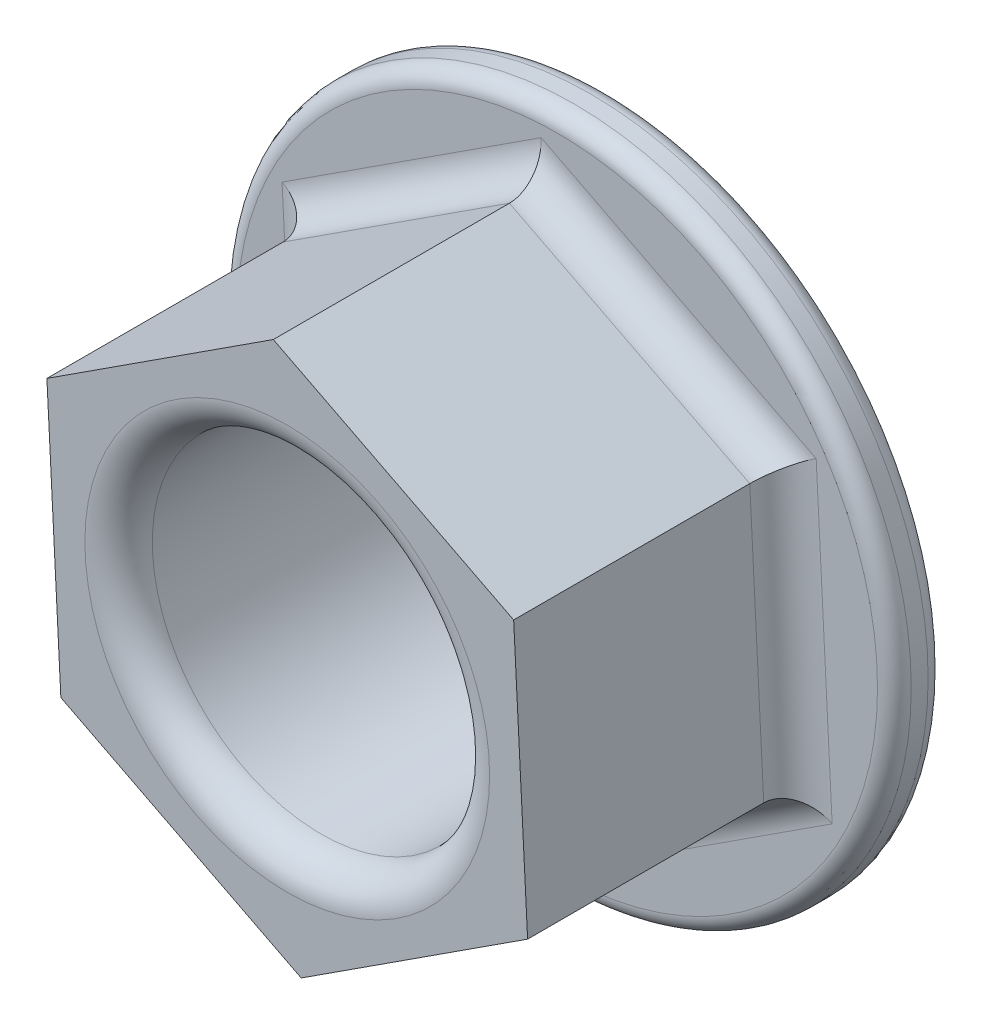
ISO-10303-21;
HEADER;
FILE_DESCRIPTION(('STEP AP214'),'2;1');
FILE_NAME('part.step','',(''),(''),'','','');
FILE_SCHEMA(('AUTOMOTIVE_DESIGN { 1 0 10303 214 1 1 1 1 }'));
ENDSEC;
DATA;
#1=APPLICATION_CONTEXT('core data for automotive mechanical design processes');
#2=APPLICATION_PROTOCOL_DEFINITION('international standard','automotive_design',2000,#1);
#3=PRODUCT_CONTEXT('',#1,'mechanical');
#4=PRODUCT('Part','Part','',(#3));
#5=PRODUCT_RELATED_PRODUCT_CATEGORY('part','',(#4));
#6=PRODUCT_DEFINITION_FORMATION('','',#4);
#7=PRODUCT_DEFINITION_CONTEXT('part definition',#1,'design');
#8=PRODUCT_DEFINITION('design','',#6,#7);
#9=PRODUCT_DEFINITION_SHAPE('','',#8);
#10=(LENGTH_UNIT() NAMED_UNIT(*) SI_UNIT(.MILLI.,.METRE.));
#11=(NAMED_UNIT(*) PLANE_ANGLE_UNIT() SI_UNIT($,.RADIAN.));
#12=(NAMED_UNIT(*) SI_UNIT($,.STERADIAN.) SOLID_ANGLE_UNIT());
#13=UNCERTAINTY_MEASURE_WITH_UNIT(LENGTH_MEASURE(1.E-05),#10,'distance_accuracy_value','');
#14=(GEOMETRIC_REPRESENTATION_CONTEXT(3) GLOBAL_UNCERTAINTY_ASSIGNED_CONTEXT((#13)) GLOBAL_UNIT_ASSIGNED_CONTEXT((#10,
#11,#12)) REPRESENTATION_CONTEXT('',''));
#15=CARTESIAN_POINT('',(0.,0.,0.));
#16=DIRECTION('',(0.,0.,1.));
#17=DIRECTION('',(1.,0.,0.));
#18=AXIS2_PLACEMENT_3D('',#15,#16,#17);
#19=CARTESIAN_POINT('',(0.,0.,1.5));
#20=DIRECTION('',(0.,0.,1.));
#21=DIRECTION('',(1.,0.,0.));
#22=AXIS2_PLACEMENT_3D('',#19,#20,#21);
#23=PLANE('',#22);
#24=DIRECTION('',(0.838996582609284,0.544136687211902,0.));
#25=VECTOR('',#24,1.);
#26=CARTESIAN_POINT('',(4.31402624126482,-6.65173541643303,1.5));
#27=LINE('',#26,#25);
#28=CARTESIAN_POINT('',(8.1544074745206,-4.16103120474768,1.5));
#29=VERTEX_POINT('',#28);
#30=CARTESIAN_POINT('',(0.473645008009034,-9.14243962811838,1.5));
#31=VERTEX_POINT('',#30);
#32=EDGE_CURVE('E152',#29,#31,#27,.F.);
#33=ORIENTED_EDGE('',*,*,#32,.T.);
#34=DIRECTION('',(0.890734485561256,-0.454524010622018,0.));
#35=VECTOR('',#34,1.);
#36=CARTESIAN_POINT('',(-3.60355872925126,-7.06192402574454,1.5));
#37=LINE('',#36,#35);
#38=CARTESIAN_POINT('',(-7.68076246651156,-4.9814084233707,1.5));
#39=VERTEX_POINT('',#38);
#40=EDGE_CURVE('E162',#31,#39,#37,.F.);
#41=ORIENTED_EDGE('',*,*,#40,.T.);
#42=DIRECTION('',(0.0517379029519728,-0.99866069783392,0.));
#43=VECTOR('',#42,1.);
#44=CARTESIAN_POINT('',(-7.91758497051608,-0.410188609311512,1.5));
#45=LINE('',#44,#43);
#46=CARTESIAN_POINT('',(-8.1544074745206,4.16103120474768,1.5));
#47=VERTEX_POINT('',#46);
#48=EDGE_CURVE('E160',#39,#47,#45,.F.);
#49=ORIENTED_EDGE('',*,*,#48,.T.);
#50=DIRECTION('',(-0.838996582609284,-0.544136687211902,0.));
#51=VECTOR('',#50,1.);
#52=CARTESIAN_POINT('',(-4.31402624126482,6.65173541643303,1.5));
#53=LINE('',#52,#51);
#54=CARTESIAN_POINT('',(-0.473645008009037,9.14243962811839,1.5));
#55=VERTEX_POINT('',#54);
#56=EDGE_CURVE('E158',#47,#55,#53,.F.);
#57=ORIENTED_EDGE('',*,*,#56,.T.);
#58=DIRECTION('',(-0.890734485561256,0.454524010622018,0.));
#59=VECTOR('',#58,1.);
#60=CARTESIAN_POINT('',(3.60355872925126,7.06192402574455,1.5));
#61=LINE('',#60,#59);
#62=CARTESIAN_POINT('',(7.68076246651156,4.98140842337071,1.5));
#63=VERTEX_POINT('',#62);
#64=EDGE_CURVE('E156',#55,#63,#61,.F.);
#65=ORIENTED_EDGE('',*,*,#64,.T.);
#66=DIRECTION('',(-0.051737902951973,0.99866069783392,0.));
#67=VECTOR('',#66,1.);
#68=CARTESIAN_POINT('',(7.91758497051608,0.410188609311513,1.5));
#69=LINE('',#68,#67);
#70=EDGE_CURVE('E154',#63,#29,#69,.F.);
#71=ORIENTED_EDGE('',*,*,#70,.T.);
#72=EDGE_LOOP('',(#33,#41,#49,#57,#65,#71));
#73=FACE_BOUND('',#72,.T.);
#74=CARTESIAN_POINT('',(0.,0.,1.5));
#75=DIRECTION('',(0.,0.,1.));
#76=DIRECTION('',(1.,0.,0.));
#77=AXIS2_PLACEMENT_3D('',#74,#75,#76);
#78=CIRCLE('',#77,9.5);
#79=CARTESIAN_POINT('',(9.5,0.,1.5));
#80=VERTEX_POINT('',#79);
#81=EDGE_CURVE('E146',#80,#80,#78,.T.);
#82=ORIENTED_EDGE('',*,*,#81,.T.);
#83=EDGE_LOOP('',(#82));
#84=FACE_BOUND('',#83,.T.);
#85=ADVANCED_FACE('F33',(#73,#84),#23,.T.);
#86=CARTESIAN_POINT('',(0.,0.,1.5));
#87=DIRECTION('',(0.,0.,-1.));
#88=DIRECTION('',(-1.,0.,0.));
#89=AXIS2_PLACEMENT_3D('',#86,#87,#88);
#90=CYLINDRICAL_SURFACE('',#89,10.);
#91=CARTESIAN_POINT('',(0.,0.,0.5));
#92=DIRECTION('',(0.,0.,1.));
#93=DIRECTION('',(1.,0.,0.));
#94=AXIS2_PLACEMENT_3D('',#91,#92,#93);
#95=CIRCLE('',#94,10.);
#96=CARTESIAN_POINT('',(10.,0.,0.5));
#97=VERTEX_POINT('',#96);
#98=EDGE_CURVE('E135',#97,#97,#95,.T.);
#99=ORIENTED_EDGE('',*,*,#98,.T.);
#100=EDGE_LOOP('',(#99));
#101=FACE_BOUND('',#100,.T.);
#102=CARTESIAN_POINT('',(0.,0.,1.));
#103=DIRECTION('',(0.,0.,1.));
#104=DIRECTION('',(1.,0.,0.));
#105=AXIS2_PLACEMENT_3D('',#102,#103,#104);
#106=CIRCLE('',#105,10.);
#107=CARTESIAN_POINT('',(10.,0.,1.));
#108=VERTEX_POINT('',#107);
#109=EDGE_CURVE('E132',#108,#108,#106,.F.);
#110=ORIENTED_EDGE('',*,*,#109,.T.);
#111=EDGE_LOOP('',(#110));
#112=FACE_BOUND('',#111,.T.);
#113=ADVANCED_FACE('F207',(#101,#112),#90,.T.);
#114=CARTESIAN_POINT('',(0.,0.,0.));
#115=DIRECTION('',(0.,0.,1.));
#116=DIRECTION('',(1.,0.,0.));
#117=AXIS2_PLACEMENT_3D('',#114,#115,#116);
#118=PLANE('',#117);
#119=CARTESIAN_POINT('',(0.,0.,0.));
#120=DIRECTION('',(0.,0.,1.));
#121=DIRECTION('',(1.,0.,0.));
#122=AXIS2_PLACEMENT_3D('',#119,#120,#121);
#123=CIRCLE('',#122,6.);
#124=CARTESIAN_POINT('',(6.,0.,0.));
#125=VERTEX_POINT('',#124);
#126=EDGE_CURVE('E172',#125,#125,#123,.T.);
#127=ORIENTED_EDGE('',*,*,#126,.T.);
#128=EDGE_LOOP('',(#127));
#129=FACE_BOUND('',#128,.T.);
#130=CARTESIAN_POINT('',(0.,0.,0.));
#131=DIRECTION('',(0.,0.,1.));
#132=DIRECTION('',(1.,0.,0.));
#133=AXIS2_PLACEMENT_3D('',#130,#131,#132);
#134=CIRCLE('',#133,9.5);
#135=CARTESIAN_POINT('',(9.5,0.,0.));
#136=VERTEX_POINT('',#135);
#137=EDGE_CURVE('E143',#136,#136,#134,.F.);
#138=ORIENTED_EDGE('',*,*,#137,.T.);
#139=EDGE_LOOP('',(#138));
#140=FACE_BOUND('',#139,.T.);
#141=ADVANCED_FACE('F203',(#129,#140),#118,.F.);
#142=CARTESIAN_POINT('',(0.,0.,0.5));
#143=DIRECTION('',(0.,0.,1.));
#144=DIRECTION('',(1.,0.,0.));
#145=AXIS2_PLACEMENT_3D('',#142,#143,#144);
#146=TOROIDAL_SURFACE('',#145,9.5,0.5);
#147=ORIENTED_EDGE('',*,*,#137,.F.);
#148=EDGE_LOOP('',(#147));
#149=FACE_BOUND('',#148,.T.);
#150=ORIENTED_EDGE('',*,*,#98,.F.);
#151=EDGE_LOOP('',(#150));
#152=FACE_BOUND('',#151,.T.);
#153=ADVANCED_FACE('F206',(#149,#152),#146,.T.);
#154=CARTESIAN_POINT('',(0.,0.,1.));
#155=DIRECTION('',(0.,0.,1.));
#156=DIRECTION('',(1.,0.,0.));
#157=AXIS2_PLACEMENT_3D('',#154,#155,#156);
#158=TOROIDAL_SURFACE('',#157,9.5,0.5);
#159=ORIENTED_EDGE('',*,*,#109,.F.);
#160=EDGE_LOOP('',(#159));
#161=FACE_BOUND('',#160,.T.);
#162=ORIENTED_EDGE('',*,*,#81,.F.);
#163=EDGE_LOOP('',(#162));
#164=FACE_BOUND('',#163,.T.);
#165=ADVANCED_FACE('F213',(#161,#164),#158,.T.);
#166=CARTESIAN_POINT('',(-0.413903223615781,7.98928558267136,9.5));
#167=DIRECTION('',(0.544136687211902,-0.838996582609284,0.));
#168=DIRECTION('',(0.838996582609284,0.544136687211902,0.));
#169=AXIS2_PLACEMENT_3D('',#166,#167,#168);
#170=PLANE('',#169);
#171=DIRECTION('',(0.,0.,-1.));
#172=VECTOR('',#171,1.);
#173=CARTESIAN_POINT('',(-0.413903223615781,7.98928558267136,9.5));
#174=LINE('',#173,#172);
#175=CARTESIAN_POINT('',(-0.413903223615781,7.98928558267136,9.5));
#176=VERTEX_POINT('',#175);
#177=CARTESIAN_POINT('',(-0.413903223615781,7.98928558267136,2.5));
#178=VERTEX_POINT('',#177);
#179=EDGE_CURVE('E288',#176,#178,#174,.T.);
#180=ORIENTED_EDGE('',*,*,#179,.T.);
#181=DIRECTION('',(-0.838996582609284,-0.544136687211902,0.));
#182=VECTOR('',#181,1.);
#183=CARTESIAN_POINT('',(-0.413903223615781,7.98928558267136,2.5));
#184=LINE('',#183,#182);
#185=CARTESIAN_POINT('',(-7.12587588449005,3.63619208497614,2.5));
#186=VERTEX_POINT('',#185);
#187=EDGE_CURVE('E131',#178,#186,#184,.T.);
#188=ORIENTED_EDGE('',*,*,#187,.T.);
#189=DIRECTION('',(0.,0.,-1.));
#190=VECTOR('',#189,1.);
#191=CARTESIAN_POINT('',(-7.12587588449005,3.63619208497614,9.5));
#192=LINE('',#191,#190);
#193=CARTESIAN_POINT('',(-7.12587588449005,3.63619208497614,9.5));
#194=VERTEX_POINT('',#193);
#195=EDGE_CURVE('E111',#194,#186,#192,.T.);
#196=ORIENTED_EDGE('',*,*,#195,.F.);
#197=DIRECTION('',(-0.838996582609284,-0.544136687211902,0.));
#198=VECTOR('',#197,1.);
#199=CARTESIAN_POINT('',(-0.413903223615781,7.98928558267136,9.5));
#200=LINE('',#199,#198);
#201=EDGE_CURVE('E118',#176,#194,#200,.T.);
#202=ORIENTED_EDGE('',*,*,#201,.F.);
#203=EDGE_LOOP('',(#180,#188,#196,#202));
#204=FACE_BOUND('',#203,.T.);
#205=ADVANCED_FACE('F129',(#204),#170,.F.);
#206=CARTESIAN_POINT('',(-7.12587588449005,3.63619208497614,9.5));
#207=DIRECTION('',(0.99866069783392,0.0517379029519728,0.));
#208=DIRECTION('',(-0.0517379029519728,0.99866069783392,0.));
#209=AXIS2_PLACEMENT_3D('',#206,#207,#208);
#210=PLANE('',#209);
#211=ORIENTED_EDGE('',*,*,#195,.T.);
#212=DIRECTION('',(0.0517379029519728,-0.99866069783392,0.));
#213=VECTOR('',#212,1.);
#214=CARTESIAN_POINT('',(-7.12587588449005,3.63619208497614,2.5));
#215=LINE('',#214,#213);
#216=CARTESIAN_POINT('',(-6.71197266087427,-4.35309349769522,2.5));
#217=VERTEX_POINT('',#216);
#218=EDGE_CURVE('E165',#186,#217,#215,.T.);
#219=ORIENTED_EDGE('',*,*,#218,.T.);
#220=DIRECTION('',(0.,0.,-1.));
#221=VECTOR('',#220,1.);
#222=CARTESIAN_POINT('',(-6.71197266087427,-4.35309349769522,9.5));
#223=LINE('',#222,#221);
#224=CARTESIAN_POINT('',(-6.71197266087427,-4.35309349769522,9.5));
#225=VERTEX_POINT('',#224);
#226=EDGE_CURVE('E114',#225,#217,#223,.T.);
#227=ORIENTED_EDGE('',*,*,#226,.F.);
#228=DIRECTION('',(0.0517379029519728,-0.99866069783392,0.));
#229=VECTOR('',#228,1.);
#230=CARTESIAN_POINT('',(-7.12587588449005,3.63619208497614,9.5));
#231=LINE('',#230,#229);
#232=EDGE_CURVE('E107',#194,#225,#231,.T.);
#233=ORIENTED_EDGE('',*,*,#232,.F.);
#234=EDGE_LOOP('',(#211,#219,#227,#233));
#235=FACE_BOUND('',#234,.T.);
#236=ADVANCED_FACE('F109',(#235),#210,.F.);
#237=CARTESIAN_POINT('',(-6.71197266087427,-4.35309349769522,9.5));
#238=DIRECTION('',(0.454524010622018,0.890734485561256,0.));
#239=DIRECTION('',(-0.890734485561256,0.454524010622018,0.));
#240=AXIS2_PLACEMENT_3D('',#237,#238,#239);
#241=PLANE('',#240);
#242=ORIENTED_EDGE('',*,*,#226,.T.);
#243=DIRECTION('',(0.890734485561256,-0.454524010622018,0.));
#244=VECTOR('',#243,1.);
#245=CARTESIAN_POINT('',(-6.71197266087427,-4.35309349769522,2.5));
#246=LINE('',#245,#244);
#247=CARTESIAN_POINT('',(0.413903223615777,-7.98928558267136,2.5));
#248=VERTEX_POINT('',#247);
#249=EDGE_CURVE('E149',#217,#248,#246,.T.);
#250=ORIENTED_EDGE('',*,*,#249,.T.);
#251=DIRECTION('',(0.,0.,-1.));
#252=VECTOR('',#251,1.);
#253=CARTESIAN_POINT('',(0.413903223615777,-7.98928558267136,9.5));
#254=LINE('',#253,#252);
#255=CARTESIAN_POINT('',(0.413903223615777,-7.98928558267136,9.5));
#256=VERTEX_POINT('',#255);
#257=EDGE_CURVE('E137',#256,#248,#254,.T.);
#258=ORIENTED_EDGE('',*,*,#257,.F.);
#259=DIRECTION('',(0.890734485561256,-0.454524010622018,0.));
#260=VECTOR('',#259,1.);
#261=CARTESIAN_POINT('',(-6.71197266087427,-4.35309349769522,9.5));
#262=LINE('',#261,#260);
#263=EDGE_CURVE('E117',#225,#256,#262,.T.);
#264=ORIENTED_EDGE('',*,*,#263,.F.);
#265=EDGE_LOOP('',(#242,#250,#258,#264));
#266=FACE_BOUND('',#265,.T.);
#267=ADVANCED_FACE('F278',(#266),#241,.F.);
#268=CARTESIAN_POINT('',(0.413903223615777,-7.98928558267136,9.5));
#269=DIRECTION('',(-0.544136687211902,0.838996582609284,0.));
#270=DIRECTION('',(-0.838996582609284,-0.544136687211902,0.));
#271=AXIS2_PLACEMENT_3D('',#268,#269,#270);
#272=PLANE('',#271);
#273=ORIENTED_EDGE('',*,*,#257,.T.);
#274=DIRECTION('',(0.838996582609284,0.544136687211902,0.));
#275=VECTOR('',#274,1.);
#276=CARTESIAN_POINT('',(0.413903223615777,-7.98928558267136,2.5));
#277=LINE('',#276,#275);
#278=CARTESIAN_POINT('',(7.12587588449005,-3.63619208497614,2.5));
#279=VERTEX_POINT('',#278);
#280=EDGE_CURVE('E48',#248,#279,#277,.T.);
#281=ORIENTED_EDGE('',*,*,#280,.T.);
#282=DIRECTION('',(0.,0.,-1.));
#283=VECTOR('',#282,1.);
#284=CARTESIAN_POINT('',(7.12587588449005,-3.63619208497614,9.5));
#285=LINE('',#284,#283);
#286=CARTESIAN_POINT('',(7.12587588449005,-3.63619208497614,9.5));
#287=VERTEX_POINT('',#286);
#288=EDGE_CURVE('E292',#287,#279,#285,.T.);
#289=ORIENTED_EDGE('',*,*,#288,.F.);
#290=DIRECTION('',(0.838996582609284,0.544136687211902,0.));
#291=VECTOR('',#290,1.);
#292=CARTESIAN_POINT('',(0.413903223615777,-7.98928558267136,9.5));
#293=LINE('',#292,#291);
#294=EDGE_CURVE('E281',#256,#287,#293,.T.);
#295=ORIENTED_EDGE('',*,*,#294,.F.);
#296=EDGE_LOOP('',(#273,#281,#289,#295));
#297=FACE_BOUND('',#296,.T.);
#298=ADVANCED_FACE('F293',(#297),#272,.F.);
#299=CARTESIAN_POINT('',(7.12587588449005,-3.63619208497614,9.5));
#300=DIRECTION('',(-0.99866069783392,-0.051737902951973,0.));
#301=DIRECTION('',(0.051737902951973,-0.99866069783392,0.));
#302=AXIS2_PLACEMENT_3D('',#299,#300,#301);
#303=PLANE('',#302);
#304=ORIENTED_EDGE('',*,*,#288,.T.);
#305=DIRECTION('',(-0.051737902951973,0.99866069783392,0.));
#306=VECTOR('',#305,1.);
#307=CARTESIAN_POINT('',(7.12587588449005,-3.63619208497614,2.5));
#308=LINE('',#307,#306);
#309=CARTESIAN_POINT('',(6.71197266087426,4.35309349769522,2.5));
#310=VERTEX_POINT('',#309);
#311=EDGE_CURVE('E55',#279,#310,#308,.T.);
#312=ORIENTED_EDGE('',*,*,#311,.T.);
#313=DIRECTION('',(0.,0.,-1.));
#314=VECTOR('',#313,1.);
#315=CARTESIAN_POINT('',(6.71197266087426,4.35309349769522,9.5));
#316=LINE('',#315,#314);
#317=CARTESIAN_POINT('',(6.71197266087426,4.35309349769522,9.5));
#318=VERTEX_POINT('',#317);
#319=EDGE_CURVE('E290',#318,#310,#316,.T.);
#320=ORIENTED_EDGE('',*,*,#319,.F.);
#321=DIRECTION('',(-0.051737902951973,0.99866069783392,0.));
#322=VECTOR('',#321,1.);
#323=CARTESIAN_POINT('',(7.12587588449005,-3.63619208497614,9.5));
#324=LINE('',#323,#322);
#325=EDGE_CURVE('E283',#287,#318,#324,.T.);
#326=ORIENTED_EDGE('',*,*,#325,.F.);
#327=EDGE_LOOP('',(#304,#312,#320,#326));
#328=FACE_BOUND('',#327,.T.);
#329=ADVANCED_FACE('F295',(#328),#303,.F.);
#330=CARTESIAN_POINT('',(6.71197266087426,4.35309349769522,9.5));
#331=DIRECTION('',(-0.454524010622018,-0.890734485561256,0.));
#332=DIRECTION('',(0.890734485561256,-0.454524010622018,0.));
#333=AXIS2_PLACEMENT_3D('',#330,#331,#332);
#334=PLANE('',#333);
#335=ORIENTED_EDGE('',*,*,#319,.T.);
#336=DIRECTION('',(-0.890734485561256,0.454524010622018,0.));
#337=VECTOR('',#336,1.);
#338=CARTESIAN_POINT('',(6.71197266087426,4.35309349769522,2.5));
#339=LINE('',#338,#337);
#340=EDGE_CURVE('E168',#310,#178,#339,.T.);
#341=ORIENTED_EDGE('',*,*,#340,.T.);
#342=ORIENTED_EDGE('',*,*,#179,.F.);
#343=DIRECTION('',(-0.890734485561256,0.454524010622018,0.));
#344=VECTOR('',#343,1.);
#345=CARTESIAN_POINT('',(6.71197266087426,4.35309349769522,9.5));
#346=LINE('',#345,#344);
#347=EDGE_CURVE('E123',#318,#176,#346,.T.);
#348=ORIENTED_EDGE('',*,*,#347,.F.);
#349=EDGE_LOOP('',(#335,#341,#342,#348));
#350=FACE_BOUND('',#349,.T.);
#351=ADVANCED_FACE('F261',(#350),#334,.F.);
#352=CARTESIAN_POINT('',(0.,0.,9.5));
#353=DIRECTION('',(0.,0.,1.));
#354=DIRECTION('',(1.,0.,0.));
#355=AXIS2_PLACEMENT_3D('',#352,#353,#354);
#356=PLANE('',#355);
#357=CARTESIAN_POINT('',(0.,0.,9.5));
#358=DIRECTION('',(0.,0.,1.));
#359=DIRECTION('',(1.,0.,0.));
#360=AXIS2_PLACEMENT_3D('',#357,#358,#359);
#361=CIRCLE('',#360,6.);
#362=CARTESIAN_POINT('',(6.,0.,9.5));
#363=VERTEX_POINT('',#362);
#364=EDGE_CURVE('E11',#363,#363,#361,.F.);
#365=ORIENTED_EDGE('',*,*,#364,.T.);
#366=EDGE_LOOP('',(#365));
#367=FACE_BOUND('',#366,.T.);
#368=ORIENTED_EDGE('',*,*,#201,.T.);
#369=ORIENTED_EDGE('',*,*,#232,.T.);
#370=ORIENTED_EDGE('',*,*,#263,.T.);
#371=ORIENTED_EDGE('',*,*,#294,.T.);
#372=ORIENTED_EDGE('',*,*,#325,.T.);
#373=ORIENTED_EDGE('',*,*,#347,.T.);
#374=EDGE_LOOP('',(#368,#369,#370,#371,#372,#373));
#375=FACE_BOUND('',#374,.T.);
#376=ADVANCED_FACE('F121',(#367,#375),#356,.T.);
#377=CARTESIAN_POINT('',(7.16649667149628,5.24382798325648,2.5));
#378=DIRECTION('',(-0.890734485561256,0.454524010622018,0.));
#379=DIRECTION('',(-0.454524010622018,-0.890734485561256,0.));
#380=AXIS2_PLACEMENT_3D('',#377,#378,#379);
#381=CYLINDRICAL_SURFACE('',#380,1.);
#382=CARTESIAN_POINT('',(7.68076246651156,4.98140842337071,2.5));
#383=DIRECTION('',(-0.544136687211902,0.838996582609284,0.));
#384=DIRECTION('',(0.838996582609284,0.544136687211902,0.));
#385=AXIS2_PLACEMENT_3D('',#382,#383,#384);
#386=ELLIPSE('',#385,1.15470053837925,1.);
#387=EDGE_CURVE('E183',#63,#310,#386,.T.);
#388=ORIENTED_EDGE('',*,*,#387,.F.);
#389=ORIENTED_EDGE('',*,*,#64,.F.);
#390=CARTESIAN_POINT('',(-0.473645008009036,9.14243962811839,2.5));
#391=DIRECTION('',(-0.99866069783392,-0.0517379029519727,0.));
#392=DIRECTION('',(-0.0517379029519728,0.99866069783392,0.));
#393=AXIS2_PLACEMENT_3D('',#390,#391,#392);
#394=ELLIPSE('',#393,1.15470053837925,1.);
#395=EDGE_CURVE('E127',#178,#55,#394,.F.);
#396=ORIENTED_EDGE('',*,*,#395,.F.);
#397=ORIENTED_EDGE('',*,*,#340,.F.);
#398=EDGE_LOOP('',(#388,#389,#396,#397));
#399=FACE_BOUND('',#398,.T.);
#400=ADVANCED_FACE('F254',(#399),#381,.F.);
#401=CARTESIAN_POINT('',(-0.958039910827683,8.82828216528064,2.5));
#402=DIRECTION('',(-0.838996582609284,-0.544136687211902,0.));
#403=DIRECTION('',(0.544136687211902,-0.838996582609284,0.));
#404=AXIS2_PLACEMENT_3D('',#401,#402,#403);
#405=CYLINDRICAL_SURFACE('',#404,1.);
#406=ORIENTED_EDGE('',*,*,#395,.T.);
#407=ORIENTED_EDGE('',*,*,#56,.F.);
#408=CARTESIAN_POINT('',(-8.1544074745206,4.16103120474768,2.5));
#409=DIRECTION('',(-0.454524010622018,-0.890734485561256,0.));
#410=DIRECTION('',(-0.890734485561256,0.454524010622018,0.));
#411=AXIS2_PLACEMENT_3D('',#408,#409,#410);
#412=ELLIPSE('',#411,1.15470053837925,1.);
#413=EDGE_CURVE('E180',#186,#47,#412,.F.);
#414=ORIENTED_EDGE('',*,*,#413,.F.);
#415=ORIENTED_EDGE('',*,*,#187,.F.);
#416=EDGE_LOOP('',(#406,#407,#414,#415));
#417=FACE_BOUND('',#416,.T.);
#418=ADVANCED_FACE('F250',(#417),#405,.F.);
#419=CARTESIAN_POINT('',(8.12453658232397,-3.58445418202416,2.5));
#420=DIRECTION('',(-0.051737902951973,0.99866069783392,0.));
#421=DIRECTION('',(-0.99866069783392,-0.051737902951973,0.));
#422=AXIS2_PLACEMENT_3D('',#419,#420,#421);
#423=CYLINDRICAL_SURFACE('',#422,1.);
#424=ORIENTED_EDGE('',*,*,#387,.T.);
#425=ORIENTED_EDGE('',*,*,#311,.F.);
#426=CARTESIAN_POINT('',(8.1544074745206,-4.16103120474768,2.5));
#427=DIRECTION('',(0.454524010622018,0.890734485561256,0.));
#428=DIRECTION('',(0.890734485561256,-0.454524010622018,0.));
#429=AXIS2_PLACEMENT_3D('',#426,#427,#428);
#430=ELLIPSE('',#429,1.15470053837925,1.);
#431=EDGE_CURVE('E177',#29,#279,#430,.T.);
#432=ORIENTED_EDGE('',*,*,#431,.F.);
#433=ORIENTED_EDGE('',*,*,#70,.F.);
#434=EDGE_LOOP('',(#424,#425,#432,#433));
#435=FACE_BOUND('',#434,.T.);
#436=ADVANCED_FACE('F246',(#435),#423,.F.);
#437=CARTESIAN_POINT('',(-8.12453658232397,3.58445418202417,2.5));
#438=DIRECTION('',(0.0517379029519728,-0.99866069783392,0.));
#439=DIRECTION('',(0.99866069783392,0.0517379029519728,0.));
#440=AXIS2_PLACEMENT_3D('',#437,#438,#439);
#441=CYLINDRICAL_SURFACE('',#440,1.);
#442=ORIENTED_EDGE('',*,*,#413,.T.);
#443=ORIENTED_EDGE('',*,*,#48,.F.);
#444=CARTESIAN_POINT('',(-7.68076246651156,-4.9814084233707,2.5));
#445=DIRECTION('',(0.544136687211902,-0.838996582609284,0.));
#446=DIRECTION('',(-0.838996582609284,-0.544136687211902,0.));
#447=AXIS2_PLACEMENT_3D('',#444,#445,#446);
#448=ELLIPSE('',#447,1.15470053837925,1.);
#449=EDGE_CURVE('E175',#217,#39,#448,.F.);
#450=ORIENTED_EDGE('',*,*,#449,.F.);
#451=ORIENTED_EDGE('',*,*,#218,.F.);
#452=EDGE_LOOP('',(#442,#443,#450,#451));
#453=FACE_BOUND('',#452,.T.);
#454=ADVANCED_FACE('F242',(#453),#441,.F.);
#455=CARTESIAN_POINT('',(0.95803991082768,-8.82828216528064,2.5));
#456=DIRECTION('',(0.838996582609284,0.544136687211902,0.));
#457=DIRECTION('',(-0.544136687211902,0.838996582609284,0.));
#458=AXIS2_PLACEMENT_3D('',#455,#456,#457);
#459=CYLINDRICAL_SURFACE('',#458,1.);
#460=ORIENTED_EDGE('',*,*,#431,.T.);
#461=ORIENTED_EDGE('',*,*,#280,.F.);
#462=CARTESIAN_POINT('',(0.473645008009033,-9.14243962811839,2.5));
#463=DIRECTION('',(0.99866069783392,0.0517379029519726,0.));
#464=DIRECTION('',(-0.0517379029519725,0.99866069783392,0.));
#465=AXIS2_PLACEMENT_3D('',#462,#463,#464);
#466=ELLIPSE('',#465,1.15470053837925,1.);
#467=EDGE_CURVE('E173',#31,#248,#466,.T.);
#468=ORIENTED_EDGE('',*,*,#467,.F.);
#469=ORIENTED_EDGE('',*,*,#32,.F.);
#470=EDGE_LOOP('',(#460,#461,#468,#469));
#471=FACE_BOUND('',#470,.T.);
#472=ADVANCED_FACE('F238',(#471),#459,.F.);
#473=CARTESIAN_POINT('',(-7.16649667149628,-5.24382798325647,2.5));
#474=DIRECTION('',(0.890734485561256,-0.454524010622018,0.));
#475=DIRECTION('',(0.454524010622018,0.890734485561256,0.));
#476=AXIS2_PLACEMENT_3D('',#473,#474,#475);
#477=CYLINDRICAL_SURFACE('',#476,1.);
#478=ORIENTED_EDGE('',*,*,#449,.T.);
#479=ORIENTED_EDGE('',*,*,#40,.F.);
#480=ORIENTED_EDGE('',*,*,#467,.T.);
#481=ORIENTED_EDGE('',*,*,#249,.F.);
#482=EDGE_LOOP('',(#478,#479,#480,#481));
#483=FACE_BOUND('',#482,.T.);
#484=ADVANCED_FACE('F235',(#483),#477,.F.);
#485=CARTESIAN_POINT('',(0.,0.,0.));
#486=DIRECTION('',(0.,0.,1.));
#487=DIRECTION('',(1.,0.,0.));
#488=AXIS2_PLACEMENT_3D('',#485,#486,#487);
#489=CYLINDRICAL_SURFACE('',#488,5.);
#490=CARTESIAN_POINT('',(0.,0.,1.));
#491=DIRECTION('',(0.,0.,1.));
#492=DIRECTION('',(1.,0.,0.));
#493=AXIS2_PLACEMENT_3D('',#490,#491,#492);
#494=CIRCLE('',#493,5.);
#495=CARTESIAN_POINT('',(5.,0.,1.));
#496=VERTEX_POINT('',#495);
#497=EDGE_CURVE('E41',#496,#496,#494,.F.);
#498=ORIENTED_EDGE('',*,*,#497,.T.);
#499=EDGE_LOOP('',(#498));
#500=FACE_BOUND('',#499,.T.);
#501=CARTESIAN_POINT('',(0.,0.,8.5));
#502=DIRECTION('',(0.,0.,1.));
#503=DIRECTION('',(1.,0.,0.));
#504=AXIS2_PLACEMENT_3D('',#501,#502,#503);
#505=CIRCLE('',#504,5.);
#506=CARTESIAN_POINT('',(5.,0.,8.5));
#507=VERTEX_POINT('',#506);
#508=EDGE_CURVE('E190',#507,#507,#505,.T.);
#509=ORIENTED_EDGE('',*,*,#508,.T.);
#510=EDGE_LOOP('',(#509));
#511=FACE_BOUND('',#510,.T.);
#512=ADVANCED_FACE('F195',(#500,#511),#489,.F.);
#513=CARTESIAN_POINT('',(0.,0.,1.));
#514=DIRECTION('',(0.,0.,1.));
#515=DIRECTION('',(1.,0.,0.));
#516=AXIS2_PLACEMENT_3D('',#513,#514,#515);
#517=TOROIDAL_SURFACE('',#516,6.,1.);
#518=ORIENTED_EDGE('',*,*,#497,.F.);
#519=EDGE_LOOP('',(#518));
#520=FACE_BOUND('',#519,.T.);
#521=ORIENTED_EDGE('',*,*,#126,.F.);
#522=EDGE_LOOP('',(#521));
#523=FACE_BOUND('',#522,.T.);
#524=ADVANCED_FACE('F198',(#520,#523),#517,.T.);
#525=CARTESIAN_POINT('',(0.,0.,8.5));
#526=DIRECTION('',(0.,0.,1.));
#527=DIRECTION('',(1.,0.,0.));
#528=AXIS2_PLACEMENT_3D('',#525,#526,#527);
#529=TOROIDAL_SURFACE('',#528,6.,1.);
#530=ORIENTED_EDGE('',*,*,#364,.F.);
#531=EDGE_LOOP('',(#530));
#532=FACE_BOUND('',#531,.T.);
#533=ORIENTED_EDGE('',*,*,#508,.F.);
#534=EDGE_LOOP('',(#533));
#535=FACE_BOUND('',#534,.T.);
#536=ADVANCED_FACE('F35',(#532,#535),#529,.T.);
#537=CLOSED_SHELL('',(#85,#113,#141,#153,#165,#205,#236,#267,#298,#329,#351,#376,#400,#418,#436,
#454,#472,#484,#512,#524,#536));
#538=MANIFOLD_SOLID_BREP('B2',#537);
#539=ADVANCED_BREP_SHAPE_REPRESENTATION('',(#18,#538),#14);
#540=SHAPE_DEFINITION_REPRESENTATION(#9,#539);
ENDSEC;
END-ISO-10303-21;
